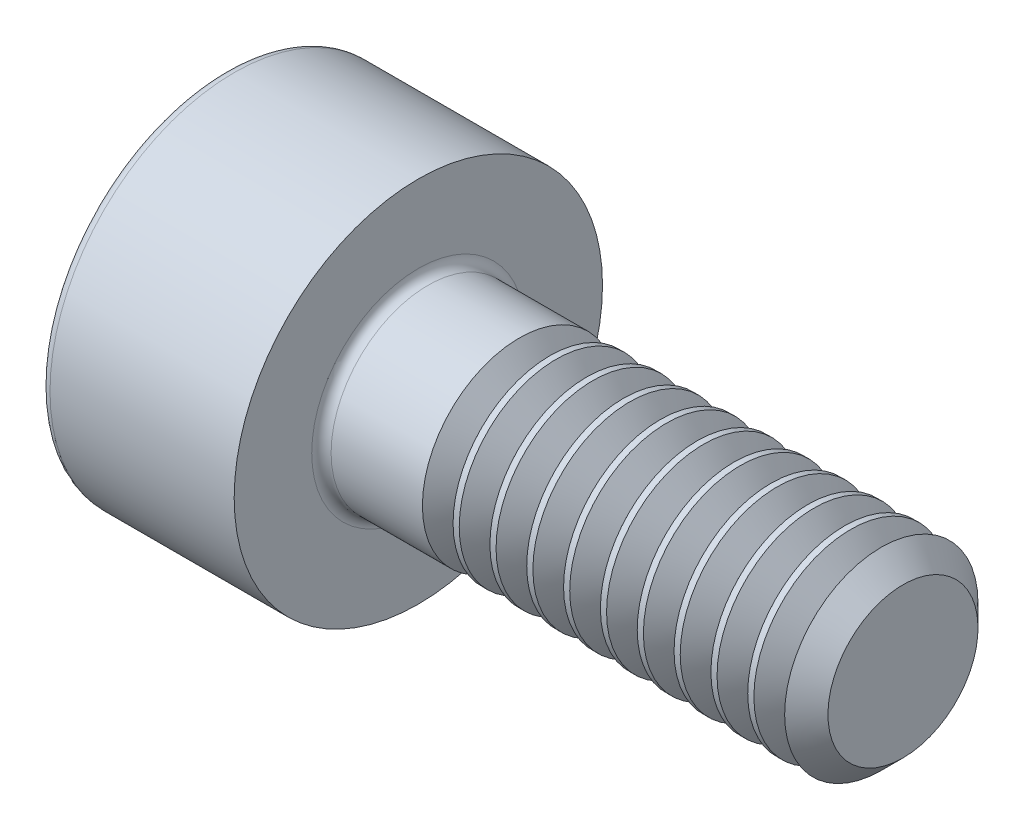
ISO-10303-21;
HEADER;
FILE_DESCRIPTION(('STEP AP214'),'2;1');
FILE_NAME('part.step','',(''),(''),'','','');
FILE_SCHEMA(('AUTOMOTIVE_DESIGN { 1 0 10303 214 1 1 1 1 }'));
ENDSEC;
DATA;
#1=APPLICATION_CONTEXT('core data for automotive mechanical design processes');
#2=APPLICATION_PROTOCOL_DEFINITION('international standard','automotive_design',2000,#1);
#3=PRODUCT_CONTEXT('',#1,'mechanical');
#4=PRODUCT('Part','Part','',(#3));
#5=PRODUCT_RELATED_PRODUCT_CATEGORY('part','',(#4));
#6=PRODUCT_DEFINITION_FORMATION('','',#4);
#7=PRODUCT_DEFINITION_CONTEXT('part definition',#1,'design');
#8=PRODUCT_DEFINITION('design','',#6,#7);
#9=PRODUCT_DEFINITION_SHAPE('','',#8);
#10=(LENGTH_UNIT() NAMED_UNIT(*) SI_UNIT(.MILLI.,.METRE.));
#11=(NAMED_UNIT(*) PLANE_ANGLE_UNIT() SI_UNIT($,.RADIAN.));
#12=(NAMED_UNIT(*) SI_UNIT($,.STERADIAN.) SOLID_ANGLE_UNIT());
#13=UNCERTAINTY_MEASURE_WITH_UNIT(LENGTH_MEASURE(1.E-05),#10,'distance_accuracy_value','');
#14=(GEOMETRIC_REPRESENTATION_CONTEXT(3) GLOBAL_UNCERTAINTY_ASSIGNED_CONTEXT((#13)) GLOBAL_UNIT_ASSIGNED_CONTEXT((#10,
#11,#12)) REPRESENTATION_CONTEXT('',''));
#15=CARTESIAN_POINT('',(0.,0.,0.));
#16=DIRECTION('',(0.,0.,1.));
#17=DIRECTION('',(1.,0.,0.));
#18=AXIS2_PLACEMENT_3D('',#15,#16,#17);
#19=CARTESIAN_POINT('',(7.,0.774,0.));
#20=DIRECTION('',(1.,0.,0.));
#21=DIRECTION('',(0.,0.,-1.));
#22=AXIS2_PLACEMENT_3D('',#19,#20,#21);
#23=PLANE('',#22);
#24=CARTESIAN_POINT('',(6.99999999994816,0.,0.));
#25=DIRECTION('',(-1.,0.,0.));
#26=DIRECTION('',(0.,-1.,0.));
#27=AXIS2_PLACEMENT_3D('',#24,#25,#26);
#28=CIRCLE('',#27,0.774000000035358);
#29=CARTESIAN_POINT('',(6.99999999994816,-0.774000000035357,0.));
#30=VERTEX_POINT('',#29);
#31=EDGE_CURVE('E303',#30,#30,#28,.T.);
#32=ORIENTED_EDGE('',*,*,#31,.F.);
#33=EDGE_LOOP('',(#32));
#34=FACE_BOUND('',#33,.T.);
#35=ADVANCED_FACE('F17',(#34),#23,.T.);
#36=CARTESIAN_POINT('',(6.77649787365908,0.,0.));
#37=DIRECTION('',(-1.,0.,0.));
#38=DIRECTION('',(0.,-1.,0.));
#39=AXIS2_PLACEMENT_3D('',#36,#37,#38);
#40=CONICAL_SURFACE('',#39,0.997502126324434,0.785398163397448);
#41=ORIENTED_EDGE('',*,*,#31,.T.);
#42=EDGE_LOOP('',(#41));
#43=FACE_BOUND('',#42,.T.);
#44=CARTESIAN_POINT('',(6.77649787371593,0.,0.));
#45=DIRECTION('',(1.,0.,0.));
#46=DIRECTION('',(0.,1.,0.));
#47=AXIS2_PLACEMENT_3D('',#44,#45,#46);
#48=CIRCLE('',#47,0.997502126324433);
#49=CARTESIAN_POINT('',(6.77649787371593,0.997502126324434,0.));
#50=VERTEX_POINT('',#49);
#51=EDGE_CURVE('E299',#50,#50,#48,.F.);
#52=ORIENTED_EDGE('',*,*,#51,.F.);
#53=EDGE_LOOP('',(#52));
#54=FACE_BOUND('',#53,.T.);
#55=ADVANCED_FACE('F871',(#43,#54),#40,.T.);
#56=CARTESIAN_POINT('',(6.77649787360224,0.,0.));
#57=DIRECTION('',(1.,0.,0.));
#58=DIRECTION('',(0.,0.,-1.));
#59=AXIS2_PLACEMENT_3D('',#56,#57,#58);
#60=CONICAL_SURFACE('',#59,0.997502126153903,0.959931088753312);
#61=CARTESIAN_POINT('',(6.61999999999807,0.,0.));
#62=DIRECTION('',(-1.,0.,0.));
#63=DIRECTION('',(0.,-1.,0.));
#64=AXIS2_PLACEMENT_3D('',#61,#62,#63);
#65=CIRCLE('',#64,0.773999999978515);
#66=CARTESIAN_POINT('',(6.61999999999807,-0.773999999978514,0.));
#67=VERTEX_POINT('',#66);
#68=EDGE_CURVE('E302',#67,#67,#65,.T.);
#69=ORIENTED_EDGE('',*,*,#68,.F.);
#70=EDGE_LOOP('',(#69));
#71=FACE_BOUND('',#70,.T.);
#72=ORIENTED_EDGE('',*,*,#51,.T.);
#73=EDGE_LOOP('',(#72));
#74=FACE_BOUND('',#73,.T.);
#75=ADVANCED_FACE('F862',(#71,#74),#60,.T.);
#76=CARTESIAN_POINT('',(6.461753096346,0.,0.));
#77=DIRECTION('',(-1.,0.,0.));
#78=DIRECTION('',(0.,0.,1.));
#79=AXIS2_PLACEMENT_3D('',#76,#77,#78);
#80=CONICAL_SURFACE('',#79,1.0000000000332,0.959931088728631);
#81=ORIENTED_EDGE('',*,*,#68,.T.);
#82=EDGE_LOOP('',(#81));
#83=FACE_BOUND('',#82,.T.);
#84=CARTESIAN_POINT('',(6.4617530963646,0.,0.));
#85=DIRECTION('',(-1.,0.,0.));
#86=DIRECTION('',(0.,0.,1.));
#87=AXIS2_PLACEMENT_3D('',#84,#85,#86);
#88=CIRCLE('',#87,1.);
#89=CARTESIAN_POINT('',(6.4617530963646,0.,1.));
#90=VERTEX_POINT('',#89);
#91=EDGE_CURVE('E298',#90,#90,#88,.T.);
#92=ORIENTED_EDGE('',*,*,#91,.F.);
#93=EDGE_LOOP('',(#92));
#94=FACE_BOUND('',#93,.T.);
#95=ADVANCED_FACE('F853',(#83,#94),#80,.T.);
#96=CARTESIAN_POINT('',(-31.75,0.,0.));
#97=DIRECTION('',(-1.,0.,0.));
#98=DIRECTION('',(0.,0.,1.));
#99=AXIS2_PLACEMENT_3D('',#96,#97,#98);
#100=CYLINDRICAL_SURFACE('',#99,1.);
#101=ORIENTED_EDGE('',*,*,#91,.T.);
#102=EDGE_LOOP('',(#101));
#103=FACE_BOUND('',#102,.T.);
#104=CARTESIAN_POINT('',(6.39824690364321,0.,0.));
#105=DIRECTION('',(1.,0.,0.));
#106=DIRECTION('',(0.,1.,0.));
#107=AXIS2_PLACEMENT_3D('',#104,#105,#106);
#108=CIRCLE('',#107,0.999999999919509);
#109=CARTESIAN_POINT('',(6.39824690364321,0.99999999991951,0.));
#110=VERTEX_POINT('',#109);
#111=EDGE_CURVE('E295',#110,#110,#108,.F.);
#112=ORIENTED_EDGE('',*,*,#111,.F.);
#113=EDGE_LOOP('',(#112));
#114=FACE_BOUND('',#113,.T.);
#115=ADVANCED_FACE('F844',(#103,#114),#100,.T.);
#116=CARTESIAN_POINT('',(6.39824690352953,0.,0.));
#117=DIRECTION('',(1.,0.,0.));
#118=DIRECTION('',(0.,0.,-1.));
#119=AXIS2_PLACEMENT_3D('',#116,#117,#118);
#120=CONICAL_SURFACE('',#119,0.999999999748979,0.959931088711648);
#121=ORIENTED_EDGE('',*,*,#111,.T.);
#122=EDGE_LOOP('',(#121));
#123=FACE_BOUND('',#122,.T.);
#124=CARTESIAN_POINT('',(6.23999999999114,0.,0.));
#125=DIRECTION('',(-1.,0.,0.));
#126=DIRECTION('',(0.,-1.,0.));
#127=AXIS2_PLACEMENT_3D('',#124,#125,#126);
#128=CIRCLE('',#127,0.773999999978515);
#129=CARTESIAN_POINT('',(6.23999999999114,-0.773999999978514,0.));
#130=VERTEX_POINT('',#129);
#131=EDGE_CURVE('E292',#130,#130,#128,.T.);
#132=ORIENTED_EDGE('',*,*,#131,.F.);
#133=EDGE_LOOP('',(#132));
#134=FACE_BOUND('',#133,.T.);
#135=ADVANCED_FACE('F835',(#123,#134),#120,.T.);
#136=CARTESIAN_POINT('',(6.08175309633907,0.,0.));
#137=DIRECTION('',(-1.,0.,0.));
#138=DIRECTION('',(0.,0.,1.));
#139=AXIS2_PLACEMENT_3D('',#136,#137,#138);
#140=CONICAL_SURFACE('',#139,1.0000000000332,0.959931088728631);
#141=CARTESIAN_POINT('',(6.08175309636461,0.,0.));
#142=DIRECTION('',(-1.,0.,0.));
#143=DIRECTION('',(0.,0.,1.));
#144=AXIS2_PLACEMENT_3D('',#141,#142,#143);
#145=CIRCLE('',#144,1.);
#146=CARTESIAN_POINT('',(6.08175309636461,0.,1.));
#147=VERTEX_POINT('',#146);
#148=EDGE_CURVE('E289',#147,#147,#145,.T.);
#149=ORIENTED_EDGE('',*,*,#148,.F.);
#150=EDGE_LOOP('',(#149));
#151=FACE_BOUND('',#150,.T.);
#152=ORIENTED_EDGE('',*,*,#131,.T.);
#153=EDGE_LOOP('',(#152));
#154=FACE_BOUND('',#153,.T.);
#155=ADVANCED_FACE('F826',(#151,#154),#140,.T.);
#156=CARTESIAN_POINT('',(-31.75,0.,0.));
#157=DIRECTION('',(-1.,0.,0.));
#158=DIRECTION('',(0.,0.,1.));
#159=AXIS2_PLACEMENT_3D('',#156,#157,#158);
#160=CYLINDRICAL_SURFACE('',#159,1.);
#161=CARTESIAN_POINT('',(6.01824690363628,0.,0.));
#162=DIRECTION('',(1.,0.,0.));
#163=DIRECTION('',(0.,1.,0.));
#164=AXIS2_PLACEMENT_3D('',#161,#162,#163);
#165=CIRCLE('',#164,0.999999999919509);
#166=CARTESIAN_POINT('',(6.01824690363628,0.99999999991951,0.));
#167=VERTEX_POINT('',#166);
#168=EDGE_CURVE('E286',#167,#167,#165,.F.);
#169=ORIENTED_EDGE('',*,*,#168,.F.);
#170=EDGE_LOOP('',(#169));
#171=FACE_BOUND('',#170,.T.);
#172=ORIENTED_EDGE('',*,*,#148,.T.);
#173=EDGE_LOOP('',(#172));
#174=FACE_BOUND('',#173,.T.);
#175=ADVANCED_FACE('F817',(#171,#174),#160,.T.);
#176=CARTESIAN_POINT('',(6.01824690352259,0.,0.));
#177=DIRECTION('',(1.,0.,0.));
#178=DIRECTION('',(0.,0.,-1.));
#179=AXIS2_PLACEMENT_3D('',#176,#177,#178);
#180=CONICAL_SURFACE('',#179,0.999999999748979,0.959931088711648);
#181=CARTESIAN_POINT('',(5.85999999998421,0.,0.));
#182=DIRECTION('',(-1.,0.,0.));
#183=DIRECTION('',(0.,-1.,0.));
#184=AXIS2_PLACEMENT_3D('',#181,#182,#183);
#185=CIRCLE('',#184,0.773999999978515);
#186=CARTESIAN_POINT('',(5.85999999998421,-0.773999999978514,0.));
#187=VERTEX_POINT('',#186);
#188=EDGE_CURVE('E283',#187,#187,#185,.T.);
#189=ORIENTED_EDGE('',*,*,#188,.F.);
#190=EDGE_LOOP('',(#189));
#191=FACE_BOUND('',#190,.T.);
#192=ORIENTED_EDGE('',*,*,#168,.T.);
#193=EDGE_LOOP('',(#192));
#194=FACE_BOUND('',#193,.T.);
#195=ADVANCED_FACE('F808',(#191,#194),#180,.T.);
#196=CARTESIAN_POINT('',(5.70175309633214,0.,0.));
#197=DIRECTION('',(-1.,0.,0.));
#198=DIRECTION('',(0.,0.,1.));
#199=AXIS2_PLACEMENT_3D('',#196,#197,#198);
#200=CONICAL_SURFACE('',#199,1.0000000000332,0.959931088728631);
#201=ORIENTED_EDGE('',*,*,#188,.T.);
#202=EDGE_LOOP('',(#201));
#203=FACE_BOUND('',#202,.T.);
#204=CARTESIAN_POINT('',(5.7017530963646,0.,0.));
#205=DIRECTION('',(-1.,0.,0.));
#206=DIRECTION('',(0.,0.,1.));
#207=AXIS2_PLACEMENT_3D('',#204,#205,#206);
#208=CIRCLE('',#207,1.);
#209=CARTESIAN_POINT('',(5.7017530963646,0.,1.));
#210=VERTEX_POINT('',#209);
#211=EDGE_CURVE('E280',#210,#210,#208,.T.);
#212=ORIENTED_EDGE('',*,*,#211,.F.);
#213=EDGE_LOOP('',(#212));
#214=FACE_BOUND('',#213,.T.);
#215=ADVANCED_FACE('F799',(#203,#214),#200,.T.);
#216=CARTESIAN_POINT('',(-31.75,0.,0.));
#217=DIRECTION('',(-1.,0.,0.));
#218=DIRECTION('',(0.,0.,1.));
#219=AXIS2_PLACEMENT_3D('',#216,#217,#218);
#220=CYLINDRICAL_SURFACE('',#219,1.);
#221=ORIENTED_EDGE('',*,*,#211,.T.);
#222=EDGE_LOOP('',(#221));
#223=FACE_BOUND('',#222,.T.);
#224=CARTESIAN_POINT('',(5.63824690362935,0.,0.));
#225=DIRECTION('',(1.,0.,0.));
#226=DIRECTION('',(0.,1.,0.));
#227=AXIS2_PLACEMENT_3D('',#224,#225,#226);
#228=CIRCLE('',#227,0.999999999919509);
#229=CARTESIAN_POINT('',(5.63824690362935,0.99999999991951,0.));
#230=VERTEX_POINT('',#229);
#231=EDGE_CURVE('E277',#230,#230,#228,.F.);
#232=ORIENTED_EDGE('',*,*,#231,.F.);
#233=EDGE_LOOP('',(#232));
#234=FACE_BOUND('',#233,.T.);
#235=ADVANCED_FACE('F790',(#223,#234),#220,.T.);
#236=CARTESIAN_POINT('',(5.63824690351566,0.,0.));
#237=DIRECTION('',(1.,0.,0.));
#238=DIRECTION('',(0.,0.,-1.));
#239=AXIS2_PLACEMENT_3D('',#236,#237,#238);
#240=CONICAL_SURFACE('',#239,0.999999999748979,0.959931088711648);
#241=ORIENTED_EDGE('',*,*,#231,.T.);
#242=EDGE_LOOP('',(#241));
#243=FACE_BOUND('',#242,.T.);
#244=CARTESIAN_POINT('',(5.47999999997728,0.,0.));
#245=DIRECTION('',(-1.,0.,0.));
#246=DIRECTION('',(0.,-1.,0.));
#247=AXIS2_PLACEMENT_3D('',#244,#245,#246);
#248=CIRCLE('',#247,0.773999999978515);
#249=CARTESIAN_POINT('',(5.47999999997728,-0.773999999978514,0.));
#250=VERTEX_POINT('',#249);
#251=EDGE_CURVE('E274',#250,#250,#248,.T.);
#252=ORIENTED_EDGE('',*,*,#251,.F.);
#253=EDGE_LOOP('',(#252));
#254=FACE_BOUND('',#253,.T.);
#255=ADVANCED_FACE('F781',(#243,#254),#240,.T.);
#256=CARTESIAN_POINT('',(5.32175309632521,0.,0.));
#257=DIRECTION('',(-1.,0.,0.));
#258=DIRECTION('',(0.,0.,1.));
#259=AXIS2_PLACEMENT_3D('',#256,#257,#258);
#260=CONICAL_SURFACE('',#259,1.0000000000332,0.959931088728631);
#261=CARTESIAN_POINT('',(5.3217530963646,0.,0.));
#262=DIRECTION('',(-1.,0.,0.));
#263=DIRECTION('',(0.,0.,1.));
#264=AXIS2_PLACEMENT_3D('',#261,#262,#263);
#265=CIRCLE('',#264,1.);
#266=CARTESIAN_POINT('',(5.3217530963646,0.,1.));
#267=VERTEX_POINT('',#266);
#268=EDGE_CURVE('E271',#267,#267,#265,.T.);
#269=ORIENTED_EDGE('',*,*,#268,.F.);
#270=EDGE_LOOP('',(#269));
#271=FACE_BOUND('',#270,.T.);
#272=ORIENTED_EDGE('',*,*,#251,.T.);
#273=EDGE_LOOP('',(#272));
#274=FACE_BOUND('',#273,.T.);
#275=ADVANCED_FACE('F772',(#271,#274),#260,.T.);
#276=CARTESIAN_POINT('',(-31.75,0.,0.));
#277=DIRECTION('',(-1.,0.,0.));
#278=DIRECTION('',(0.,0.,1.));
#279=AXIS2_PLACEMENT_3D('',#276,#277,#278);
#280=CYLINDRICAL_SURFACE('',#279,1.);
#281=CARTESIAN_POINT('',(5.25824690362242,0.,0.));
#282=DIRECTION('',(1.,0.,0.));
#283=DIRECTION('',(0.,1.,0.));
#284=AXIS2_PLACEMENT_3D('',#281,#282,#283);
#285=CIRCLE('',#284,0.999999999919509);
#286=CARTESIAN_POINT('',(5.25824690362242,0.99999999991951,0.));
#287=VERTEX_POINT('',#286);
#288=EDGE_CURVE('E268',#287,#287,#285,.F.);
#289=ORIENTED_EDGE('',*,*,#288,.F.);
#290=EDGE_LOOP('',(#289));
#291=FACE_BOUND('',#290,.T.);
#292=ORIENTED_EDGE('',*,*,#268,.T.);
#293=EDGE_LOOP('',(#292));
#294=FACE_BOUND('',#293,.T.);
#295=ADVANCED_FACE('F763',(#291,#294),#280,.T.);
#296=CARTESIAN_POINT('',(5.25824690350873,0.,0.));
#297=DIRECTION('',(1.,0.,0.));
#298=DIRECTION('',(0.,0.,-1.));
#299=AXIS2_PLACEMENT_3D('',#296,#297,#298);
#300=CONICAL_SURFACE('',#299,0.999999999748979,0.959931088711648);
#301=CARTESIAN_POINT('',(5.10000000002719,0.,0.));
#302=DIRECTION('',(-1.,0.,0.));
#303=DIRECTION('',(0.,-1.,0.));
#304=AXIS2_PLACEMENT_3D('',#301,#302,#303);
#305=CIRCLE('',#304,0.773999999978515);
#306=CARTESIAN_POINT('',(5.10000000002719,-0.773999999978514,0.));
#307=VERTEX_POINT('',#306);
#308=EDGE_CURVE('E265',#307,#307,#305,.T.);
#309=ORIENTED_EDGE('',*,*,#308,.F.);
#310=EDGE_LOOP('',(#309));
#311=FACE_BOUND('',#310,.T.);
#312=ORIENTED_EDGE('',*,*,#288,.T.);
#313=EDGE_LOOP('',(#312));
#314=FACE_BOUND('',#313,.T.);
#315=ADVANCED_FACE('F754',(#311,#314),#300,.T.);
#316=CARTESIAN_POINT('',(4.94175309637512,0.,0.));
#317=DIRECTION('',(-1.,0.,0.));
#318=DIRECTION('',(0.,0.,1.));
#319=AXIS2_PLACEMENT_3D('',#316,#317,#318);
#320=CONICAL_SURFACE('',#319,1.0000000000332,0.959931088728631);
#321=ORIENTED_EDGE('',*,*,#308,.T.);
#322=EDGE_LOOP('',(#321));
#323=FACE_BOUND('',#322,.T.);
#324=CARTESIAN_POINT('',(4.9417530963646,0.,0.));
#325=DIRECTION('',(-1.,0.,0.));
#326=DIRECTION('',(0.,0.,1.));
#327=AXIS2_PLACEMENT_3D('',#324,#325,#326);
#328=CIRCLE('',#327,1.);
#329=CARTESIAN_POINT('',(4.9417530963646,0.,1.));
#330=VERTEX_POINT('',#329);
#331=EDGE_CURVE('E262',#330,#330,#328,.T.);
#332=ORIENTED_EDGE('',*,*,#331,.F.);
#333=EDGE_LOOP('',(#332));
#334=FACE_BOUND('',#333,.T.);
#335=ADVANCED_FACE('F745',(#323,#334),#320,.T.);
#336=CARTESIAN_POINT('',(-31.75,0.,0.));
#337=DIRECTION('',(-1.,0.,0.));
#338=DIRECTION('',(0.,0.,1.));
#339=AXIS2_PLACEMENT_3D('',#336,#337,#338);
#340=CYLINDRICAL_SURFACE('',#339,1.);
#341=ORIENTED_EDGE('',*,*,#331,.T.);
#342=EDGE_LOOP('',(#341));
#343=FACE_BOUND('',#342,.T.);
#344=CARTESIAN_POINT('',(4.87824690361549,0.,0.));
#345=DIRECTION('',(1.,0.,0.));
#346=DIRECTION('',(0.,1.,0.));
#347=AXIS2_PLACEMENT_3D('',#344,#345,#346);
#348=CIRCLE('',#347,0.999999999919509);
#349=CARTESIAN_POINT('',(4.87824690361549,0.99999999991951,0.));
#350=VERTEX_POINT('',#349);
#351=EDGE_CURVE('E259',#350,#350,#348,.F.);
#352=ORIENTED_EDGE('',*,*,#351,.F.);
#353=EDGE_LOOP('',(#352));
#354=FACE_BOUND('',#353,.T.);
#355=ADVANCED_FACE('F736',(#343,#354),#340,.T.);
#356=CARTESIAN_POINT('',(4.8782469035018,0.,0.));
#357=DIRECTION('',(1.,0.,0.));
#358=DIRECTION('',(0.,0.,-1.));
#359=AXIS2_PLACEMENT_3D('',#356,#357,#358);
#360=CONICAL_SURFACE('',#359,0.999999999748979,0.959931088711648);
#361=ORIENTED_EDGE('',*,*,#351,.T.);
#362=EDGE_LOOP('',(#361));
#363=FACE_BOUND('',#362,.T.);
#364=CARTESIAN_POINT('',(4.72000000002026,0.,0.));
#365=DIRECTION('',(-1.,0.,0.));
#366=DIRECTION('',(0.,-1.,0.));
#367=AXIS2_PLACEMENT_3D('',#364,#365,#366);
#368=CIRCLE('',#367,0.773999999978515);
#369=CARTESIAN_POINT('',(4.72000000002026,-0.773999999978514,0.));
#370=VERTEX_POINT('',#369);
#371=EDGE_CURVE('E256',#370,#370,#368,.T.);
#372=ORIENTED_EDGE('',*,*,#371,.F.);
#373=EDGE_LOOP('',(#372));
#374=FACE_BOUND('',#373,.T.);
#375=ADVANCED_FACE('F727',(#363,#374),#360,.T.);
#376=CARTESIAN_POINT('',(4.56175309636819,0.,0.));
#377=DIRECTION('',(-1.,0.,0.));
#378=DIRECTION('',(0.,0.,1.));
#379=AXIS2_PLACEMENT_3D('',#376,#377,#378);
#380=CONICAL_SURFACE('',#379,1.0000000000332,0.959931088728631);
#381=CARTESIAN_POINT('',(4.56175309636461,0.,0.));
#382=DIRECTION('',(-1.,0.,0.));
#383=DIRECTION('',(0.,0.,1.));
#384=AXIS2_PLACEMENT_3D('',#381,#382,#383);
#385=CIRCLE('',#384,1.);
#386=CARTESIAN_POINT('',(4.56175309636461,0.,1.));
#387=VERTEX_POINT('',#386);
#388=EDGE_CURVE('E253',#387,#387,#385,.T.);
#389=ORIENTED_EDGE('',*,*,#388,.F.);
#390=EDGE_LOOP('',(#389));
#391=FACE_BOUND('',#390,.T.);
#392=ORIENTED_EDGE('',*,*,#371,.T.);
#393=EDGE_LOOP('',(#392));
#394=FACE_BOUND('',#393,.T.);
#395=ADVANCED_FACE('F718',(#391,#394),#380,.T.);
#396=CARTESIAN_POINT('',(-31.75,0.,0.));
#397=DIRECTION('',(-1.,0.,0.));
#398=DIRECTION('',(0.,0.,1.));
#399=AXIS2_PLACEMENT_3D('',#396,#397,#398);
#400=CYLINDRICAL_SURFACE('',#399,1.);
#401=CARTESIAN_POINT('',(4.49824690360856,0.,0.));
#402=DIRECTION('',(1.,0.,0.));
#403=DIRECTION('',(0.,1.,0.));
#404=AXIS2_PLACEMENT_3D('',#401,#402,#403);
#405=CIRCLE('',#404,0.999999999919509);
#406=CARTESIAN_POINT('',(4.49824690360856,0.99999999991951,0.));
#407=VERTEX_POINT('',#406);
#408=EDGE_CURVE('E250',#407,#407,#405,.F.);
#409=ORIENTED_EDGE('',*,*,#408,.F.);
#410=EDGE_LOOP('',(#409));
#411=FACE_BOUND('',#410,.T.);
#412=ORIENTED_EDGE('',*,*,#388,.T.);
#413=EDGE_LOOP('',(#412));
#414=FACE_BOUND('',#413,.T.);
#415=ADVANCED_FACE('F709',(#411,#414),#400,.T.);
#416=CARTESIAN_POINT('',(4.49824690349487,0.,0.));
#417=DIRECTION('',(1.,0.,0.));
#418=DIRECTION('',(0.,0.,-1.));
#419=AXIS2_PLACEMENT_3D('',#416,#417,#418);
#420=CONICAL_SURFACE('',#419,0.999999999748979,0.959931088711648);
#421=CARTESIAN_POINT('',(4.34000000001333,0.,0.));
#422=DIRECTION('',(-1.,0.,0.));
#423=DIRECTION('',(0.,-1.,0.));
#424=AXIS2_PLACEMENT_3D('',#421,#422,#423);
#425=CIRCLE('',#424,0.773999999978515);
#426=CARTESIAN_POINT('',(4.34000000001333,-0.773999999978514,0.));
#427=VERTEX_POINT('',#426);
#428=EDGE_CURVE('E247',#427,#427,#425,.T.);
#429=ORIENTED_EDGE('',*,*,#428,.F.);
#430=EDGE_LOOP('',(#429));
#431=FACE_BOUND('',#430,.T.);
#432=ORIENTED_EDGE('',*,*,#408,.T.);
#433=EDGE_LOOP('',(#432));
#434=FACE_BOUND('',#433,.T.);
#435=ADVANCED_FACE('F700',(#431,#434),#420,.T.);
#436=CARTESIAN_POINT('',(4.18175309636126,0.,0.));
#437=DIRECTION('',(-1.,0.,0.));
#438=DIRECTION('',(0.,0.,1.));
#439=AXIS2_PLACEMENT_3D('',#436,#437,#438);
#440=CONICAL_SURFACE('',#439,1.0000000000332,0.959931088728631);
#441=ORIENTED_EDGE('',*,*,#428,.T.);
#442=EDGE_LOOP('',(#441));
#443=FACE_BOUND('',#442,.T.);
#444=CARTESIAN_POINT('',(4.18175309636461,0.,0.));
#445=DIRECTION('',(-1.,0.,0.));
#446=DIRECTION('',(0.,0.,1.));
#447=AXIS2_PLACEMENT_3D('',#444,#445,#446);
#448=CIRCLE('',#447,1.);
#449=CARTESIAN_POINT('',(4.18175309636461,0.,1.));
#450=VERTEX_POINT('',#449);
#451=EDGE_CURVE('E244',#450,#450,#448,.T.);
#452=ORIENTED_EDGE('',*,*,#451,.F.);
#453=EDGE_LOOP('',(#452));
#454=FACE_BOUND('',#453,.T.);
#455=ADVANCED_FACE('F691',(#443,#454),#440,.T.);
#456=CARTESIAN_POINT('',(-31.75,0.,0.));
#457=DIRECTION('',(-1.,0.,0.));
#458=DIRECTION('',(0.,0.,1.));
#459=AXIS2_PLACEMENT_3D('',#456,#457,#458);
#460=CYLINDRICAL_SURFACE('',#459,1.);
#461=ORIENTED_EDGE('',*,*,#451,.T.);
#462=EDGE_LOOP('',(#461));
#463=FACE_BOUND('',#462,.T.);
#464=CARTESIAN_POINT('',(4.11824690365847,0.,0.));
#465=DIRECTION('',(1.,0.,0.));
#466=DIRECTION('',(0.,1.,0.));
#467=AXIS2_PLACEMENT_3D('',#464,#465,#466);
#468=CIRCLE('',#467,0.999999999919509);
#469=CARTESIAN_POINT('',(4.11824690365847,0.99999999991951,0.));
#470=VERTEX_POINT('',#469);
#471=EDGE_CURVE('E241',#470,#470,#468,.F.);
#472=ORIENTED_EDGE('',*,*,#471,.F.);
#473=EDGE_LOOP('',(#472));
#474=FACE_BOUND('',#473,.T.);
#475=ADVANCED_FACE('F682',(#463,#474),#460,.T.);
#476=CARTESIAN_POINT('',(4.11824690354479,0.,0.));
#477=DIRECTION('',(1.,0.,0.));
#478=DIRECTION('',(0.,0.,-1.));
#479=AXIS2_PLACEMENT_3D('',#476,#477,#478);
#480=CONICAL_SURFACE('',#479,0.999999999748979,0.959931088711648);
#481=ORIENTED_EDGE('',*,*,#471,.T.);
#482=EDGE_LOOP('',(#481));
#483=FACE_BOUND('',#482,.T.);
#484=CARTESIAN_POINT('',(3.9600000000064,0.,0.));
#485=DIRECTION('',(-1.,0.,0.));
#486=DIRECTION('',(0.,-1.,0.));
#487=AXIS2_PLACEMENT_3D('',#484,#485,#486);
#488=CIRCLE('',#487,0.773999999978515);
#489=CARTESIAN_POINT('',(3.9600000000064,-0.773999999978514,0.));
#490=VERTEX_POINT('',#489);
#491=EDGE_CURVE('E238',#490,#490,#488,.T.);
#492=ORIENTED_EDGE('',*,*,#491,.F.);
#493=EDGE_LOOP('',(#492));
#494=FACE_BOUND('',#493,.T.);
#495=ADVANCED_FACE('F673',(#483,#494),#480,.T.);
#496=CARTESIAN_POINT('',(3.80175309635433,0.,0.));
#497=DIRECTION('',(-1.,0.,0.));
#498=DIRECTION('',(0.,-1.,0.));
#499=AXIS2_PLACEMENT_3D('',#496,#497,#498);
#500=CONICAL_SURFACE('',#499,1.0000000000332,0.959931088728629);
#501=CARTESIAN_POINT('',(3.8017530963646,0.,0.));
#502=DIRECTION('',(-1.,0.,0.));
#503=DIRECTION('',(0.,0.,1.));
#504=AXIS2_PLACEMENT_3D('',#501,#502,#503);
#505=CIRCLE('',#504,1.);
#506=CARTESIAN_POINT('',(3.8017530963646,0.,1.));
#507=VERTEX_POINT('',#506);
#508=EDGE_CURVE('E233',#507,#507,#505,.T.);
#509=ORIENTED_EDGE('',*,*,#508,.F.);
#510=EDGE_LOOP('',(#509));
#511=FACE_BOUND('',#510,.T.);
#512=ORIENTED_EDGE('',*,*,#491,.T.);
#513=EDGE_LOOP('',(#512));
#514=FACE_BOUND('',#513,.T.);
#515=ADVANCED_FACE('F664',(#511,#514),#500,.T.);
#516=CARTESIAN_POINT('',(-31.75,0.,0.));
#517=DIRECTION('',(-1.,0.,0.));
#518=DIRECTION('',(0.,0.,1.));
#519=AXIS2_PLACEMENT_3D('',#516,#517,#518);
#520=CYLINDRICAL_SURFACE('',#519,1.);
#521=CARTESIAN_POINT('',(3.73824690365154,0.,0.));
#522=DIRECTION('',(1.,0.,0.));
#523=DIRECTION('',(0.,1.,0.));
#524=AXIS2_PLACEMENT_3D('',#521,#522,#523);
#525=CIRCLE('',#524,0.999999999919509);
#526=CARTESIAN_POINT('',(3.73824690365154,0.99999999991951,0.));
#527=VERTEX_POINT('',#526);
#528=EDGE_CURVE('E230',#527,#527,#525,.F.);
#529=ORIENTED_EDGE('',*,*,#528,.F.);
#530=EDGE_LOOP('',(#529));
#531=FACE_BOUND('',#530,.T.);
#532=ORIENTED_EDGE('',*,*,#508,.T.);
#533=EDGE_LOOP('',(#532));
#534=FACE_BOUND('',#533,.T.);
#535=ADVANCED_FACE('F655',(#531,#534),#520,.T.);
#536=CARTESIAN_POINT('',(3.73824690353786,0.,0.));
#537=DIRECTION('',(1.,0.,0.));
#538=DIRECTION('',(0.,0.,-1.));
#539=AXIS2_PLACEMENT_3D('',#536,#537,#538);
#540=CONICAL_SURFACE('',#539,0.999999999748979,0.959931088711648);
#541=CARTESIAN_POINT('',(3.57999999994263,0.,0.));
#542=DIRECTION('',(-1.,0.,0.));
#543=DIRECTION('',(0.,-1.,0.));
#544=AXIS2_PLACEMENT_3D('',#541,#542,#543);
#545=CIRCLE('',#544,0.774000000035358);
#546=CARTESIAN_POINT('',(3.57999999994263,-0.774000000035357,0.));
#547=VERTEX_POINT('',#546);
#548=EDGE_CURVE('E227',#547,#547,#545,.T.);
#549=ORIENTED_EDGE('',*,*,#548,.F.);
#550=EDGE_LOOP('',(#549));
#551=FACE_BOUND('',#550,.T.);
#552=ORIENTED_EDGE('',*,*,#528,.T.);
#553=EDGE_LOOP('',(#552));
#554=FACE_BOUND('',#553,.T.);
#555=ADVANCED_FACE('F646',(#551,#554),#540,.T.);
#556=CARTESIAN_POINT('',(3.4217530963474,0.,0.));
#557=DIRECTION('',(-1.,0.,0.));
#558=DIRECTION('',(0.,-1.,0.));
#559=AXIS2_PLACEMENT_3D('',#556,#557,#558);
#560=CONICAL_SURFACE('',#559,0.999999999976354,0.959931088644069);
#561=ORIENTED_EDGE('',*,*,#548,.T.);
#562=EDGE_LOOP('',(#561));
#563=FACE_BOUND('',#562,.T.);
#564=CARTESIAN_POINT('',(3.4217530963646,0.,0.));
#565=DIRECTION('',(-1.,0.,0.));
#566=DIRECTION('',(0.,0.,1.));
#567=AXIS2_PLACEMENT_3D('',#564,#565,#566);
#568=CIRCLE('',#567,1.);
#569=CARTESIAN_POINT('',(3.4217530963646,0.,1.));
#570=VERTEX_POINT('',#569);
#571=EDGE_CURVE('E224',#570,#570,#568,.T.);
#572=ORIENTED_EDGE('',*,*,#571,.F.);
#573=EDGE_LOOP('',(#572));
#574=FACE_BOUND('',#573,.T.);
#575=ADVANCED_FACE('F637',(#563,#574),#560,.T.);
#576=CARTESIAN_POINT('',(-31.75,0.,0.));
#577=DIRECTION('',(-1.,0.,0.));
#578=DIRECTION('',(0.,0.,1.));
#579=AXIS2_PLACEMENT_3D('',#576,#577,#578);
#580=CYLINDRICAL_SURFACE('',#579,1.);
#581=ORIENTED_EDGE('',*,*,#571,.T.);
#582=EDGE_LOOP('',(#581));
#583=FACE_BOUND('',#582,.T.);
#584=CARTESIAN_POINT('',(3.35824690364461,0.,0.));
#585=DIRECTION('',(1.,0.,0.));
#586=DIRECTION('',(0.,1.,0.));
#587=AXIS2_PLACEMENT_3D('',#584,#585,#586);
#588=CIRCLE('',#587,0.999999999919509);
#589=CARTESIAN_POINT('',(3.35824690364461,0.99999999991951,0.));
#590=VERTEX_POINT('',#589);
#591=EDGE_CURVE('E221',#590,#590,#588,.F.);
#592=ORIENTED_EDGE('',*,*,#591,.F.);
#593=EDGE_LOOP('',(#592));
#594=FACE_BOUND('',#593,.T.);
#595=ADVANCED_FACE('F628',(#583,#594),#580,.T.);
#596=CARTESIAN_POINT('',(3.35824690353093,0.,0.));
#597=DIRECTION('',(1.,0.,0.));
#598=DIRECTION('',(0.,1.,0.));
#599=AXIS2_PLACEMENT_3D('',#596,#597,#598);
#600=CONICAL_SURFACE('',#599,0.999999999748979,0.959931088711648);
#601=ORIENTED_EDGE('',*,*,#591,.T.);
#602=EDGE_LOOP('',(#601));
#603=FACE_BOUND('',#602,.T.);
#604=CARTESIAN_POINT('',(3.19999999999254,0.,0.));
#605=DIRECTION('',(-1.,0.,0.));
#606=DIRECTION('',(0.,-1.,0.));
#607=AXIS2_PLACEMENT_3D('',#604,#605,#606);
#608=CIRCLE('',#607,0.773999999978515);
#609=CARTESIAN_POINT('',(3.19999999999254,-0.773999999978514,0.));
#610=VERTEX_POINT('',#609);
#611=EDGE_CURVE('E108',#610,#610,#608,.T.);
#612=ORIENTED_EDGE('',*,*,#611,.F.);
#613=EDGE_LOOP('',(#612));
#614=FACE_BOUND('',#613,.T.);
#615=ADVANCED_FACE('F619',(#603,#614),#600,.T.);
#616=CARTESIAN_POINT('',(1.0000000000332,0.,0.));
#617=DIRECTION('',(-1.,0.,0.));
#618=DIRECTION('',(0.,0.,1.));
#619=AXIS2_PLACEMENT_3D('',#616,#617,#618);
#620=CONICAL_SURFACE('',#619,0.772499999868614,1.04719755118058);
#621=CARTESIAN_POINT('',(1.44600308294685,0.,1.13686837721616E-10));
#622=VERTEX_POINT('',#621);
#623=VERTEX_LOOP('',#622);
#624=FACE_BOUND('',#623,.T.);
#625=CARTESIAN_POINT('',(0.999999999967559,0.,0.));
#626=DIRECTION('',(-1.,0.,0.));
#627=DIRECTION('',(0.,0.,1.));
#628=AXIS2_PLACEMENT_3D('',#625,#626,#627);
#629=CIRCLE('',#628,0.772499999982301);
#630=CARTESIAN_POINT('',(0.99999999998378,-0.669004624415815,0.386249999995576));
#631=VERTEX_POINT('',#630);
#632=CARTESIAN_POINT('',(0.999999999992079,0.,0.772499999967152));
#633=VERTEX_POINT('',#632);
#634=EDGE_CURVE('E97',#631,#633,#629,.T.);
#635=ORIENTED_EDGE('',*,*,#634,.T.);
#636=CARTESIAN_POINT('',(0.999999999967559,0.,0.));
#637=DIRECTION('',(-1.,0.,0.));
#638=DIRECTION('',(0.,0.,1.));
#639=AXIS2_PLACEMENT_3D('',#636,#637,#638);
#640=CIRCLE('',#639,0.772499999982301);
#641=CARTESIAN_POINT('',(0.99999999998378,0.669004624415814,0.386249999995574));
#642=VERTEX_POINT('',#641);
#643=EDGE_CURVE('E100',#633,#642,#640,.T.);
#644=ORIENTED_EDGE('',*,*,#643,.T.);
#645=CARTESIAN_POINT('',(0.999999999967559,0.,0.));
#646=DIRECTION('',(-1.,0.,0.));
#647=DIRECTION('',(0.,0.,1.));
#648=AXIS2_PLACEMENT_3D('',#645,#646,#647);
#649=CIRCLE('',#648,0.772499999982301);
#650=CARTESIAN_POINT('',(0.99999999998378,0.669004624415814,-0.386249999995576));
#651=VERTEX_POINT('',#650);
#652=EDGE_CURVE('E103',#642,#651,#649,.T.);
#653=ORIENTED_EDGE('',*,*,#652,.T.);
#654=CARTESIAN_POINT('',(0.999999999967559,0.,0.));
#655=DIRECTION('',(-1.,0.,0.));
#656=DIRECTION('',(0.,0.,1.));
#657=AXIS2_PLACEMENT_3D('',#654,#655,#656);
#658=CIRCLE('',#657,0.772499999982301);
#659=CARTESIAN_POINT('',(0.999999999992079,0.,-0.772499999967156));
#660=VERTEX_POINT('',#659);
#661=EDGE_CURVE('E118',#651,#660,#658,.T.);
#662=ORIENTED_EDGE('',*,*,#661,.T.);
#663=CARTESIAN_POINT('',(0.999999999967559,0.,0.));
#664=DIRECTION('',(-1.,0.,0.));
#665=DIRECTION('',(0.,0.,1.));
#666=AXIS2_PLACEMENT_3D('',#663,#664,#665);
#667=CIRCLE('',#666,0.772499999982301);
#668=CARTESIAN_POINT('',(0.99999999998378,-0.669004624415817,-0.386249999995576));
#669=VERTEX_POINT('',#668);
#670=EDGE_CURVE('E119',#660,#669,#667,.T.);
#671=ORIENTED_EDGE('',*,*,#670,.T.);
#672=CARTESIAN_POINT('',(0.999999999967559,0.,0.));
#673=DIRECTION('',(-1.,0.,0.));
#674=DIRECTION('',(0.,0.,1.));
#675=AXIS2_PLACEMENT_3D('',#672,#673,#674);
#676=CIRCLE('',#675,0.772499999982301);
#677=EDGE_CURVE('E313',#669,#631,#676,.T.);
#678=ORIENTED_EDGE('',*,*,#677,.T.);
#679=EDGE_LOOP('',(#635,#644,#653,#662,#671,#678));
#680=FACE_BOUND('',#679,.T.);
#681=ADVANCED_FACE('F102',(#624,#680),#620,.F.);
#682=CARTESIAN_POINT('',(3.04175309634047,0.,0.));
#683=DIRECTION('',(-1.,0.,0.));
#684=DIRECTION('',(0.,0.,1.));
#685=AXIS2_PLACEMENT_3D('',#682,#683,#684);
#686=CONICAL_SURFACE('',#685,1.0000000000332,0.959931088728631);
#687=CARTESIAN_POINT('',(3.04175309636461,0.,0.));
#688=DIRECTION('',(-1.,0.,0.));
#689=DIRECTION('',(0.,0.,1.));
#690=AXIS2_PLACEMENT_3D('',#687,#688,#689);
#691=CIRCLE('',#690,1.);
#692=CARTESIAN_POINT('',(3.04175309636461,0.,1.));
#693=VERTEX_POINT('',#692);
#694=EDGE_CURVE('E133',#693,#693,#691,.T.);
#695=ORIENTED_EDGE('',*,*,#694,.F.);
#696=EDGE_LOOP('',(#695));
#697=FACE_BOUND('',#696,.T.);
#698=ORIENTED_EDGE('',*,*,#611,.T.);
#699=EDGE_LOOP('',(#698));
#700=FACE_BOUND('',#699,.T.);
#701=ADVANCED_FACE('F603',(#697,#700),#686,.T.);
#702=CARTESIAN_POINT('',(1.,0.,1.545));
#703=DIRECTION('',(1.,0.,0.));
#704=DIRECTION('',(0.,0.,-1.));
#705=AXIS2_PLACEMENT_3D('',#702,#703,#704);
#706=PLANE('',#705);
#707=DIRECTION('',(0.,0.499999999999999,-0.866025403784439));
#708=VECTOR('',#707,1.);
#709=CARTESIAN_POINT('',(1.,0.892006165897969,0.));
#710=LINE('',#709,#708);
#711=CARTESIAN_POINT('',(1.,0.446003082948984,0.772499999999997));
#712=VERTEX_POINT('',#711);
#713=EDGE_CURVE('E122',#642,#712,#710,.F.);
#714=ORIENTED_EDGE('',*,*,#713,.F.);
#715=ORIENTED_EDGE('',*,*,#643,.F.);
#716=DIRECTION('',(0.,-1.,0.));
#717=VECTOR('',#716,1.);
#718=CARTESIAN_POINT('',(1.,-0.446003082948989,0.772499999999998));
#719=LINE('',#718,#717);
#720=EDGE_CURVE('E124',#633,#712,#719,.F.);
#721=ORIENTED_EDGE('',*,*,#720,.T.);
#722=EDGE_LOOP('',(#714,#715,#721));
#723=FACE_BOUND('',#722,.T.);
#724=ADVANCED_FACE('F123',(#723),#706,.F.);
#725=CARTESIAN_POINT('',(1.,0.,1.545));
#726=DIRECTION('',(1.,0.,0.));
#727=DIRECTION('',(0.,0.,-1.));
#728=AXIS2_PLACEMENT_3D('',#725,#726,#727);
#729=PLANE('',#728);
#730=DIRECTION('',(0.,-1.,0.));
#731=VECTOR('',#730,1.);
#732=CARTESIAN_POINT('',(1.,-0.446003082948989,0.772499999999998));
#733=LINE('',#732,#731);
#734=CARTESIAN_POINT('',(1.,-0.446003082948989,0.772499999999998));
#735=VERTEX_POINT('',#734);
#736=EDGE_CURVE('E128',#735,#633,#733,.F.);
#737=ORIENTED_EDGE('',*,*,#736,.T.);
#738=ORIENTED_EDGE('',*,*,#634,.F.);
#739=DIRECTION('',(0.,0.500000000000001,0.866025403784438));
#740=VECTOR('',#739,1.);
#741=CARTESIAN_POINT('',(1.,-0.446003082948989,0.772499999999998));
#742=LINE('',#741,#740);
#743=EDGE_CURVE('E183',#735,#631,#742,.F.);
#744=ORIENTED_EDGE('',*,*,#743,.F.);
#745=EDGE_LOOP('',(#737,#738,#744));
#746=FACE_BOUND('',#745,.T.);
#747=ADVANCED_FACE('F459',(#746),#729,.F.);
#748=CARTESIAN_POINT('',(1.,0.,1.545));
#749=DIRECTION('',(1.,0.,0.));
#750=DIRECTION('',(0.,0.,-1.));
#751=AXIS2_PLACEMENT_3D('',#748,#749,#750);
#752=PLANE('',#751);
#753=DIRECTION('',(0.,0.500000000000001,0.866025403784438));
#754=VECTOR('',#753,1.);
#755=CARTESIAN_POINT('',(1.,-0.446003082948989,0.772499999999998));
#756=LINE('',#755,#754);
#757=CARTESIAN_POINT('',(1.,-0.892006165897975,0.));
#758=VERTEX_POINT('',#757);
#759=EDGE_CURVE('E179',#631,#758,#756,.F.);
#760=ORIENTED_EDGE('',*,*,#759,.F.);
#761=ORIENTED_EDGE('',*,*,#677,.F.);
#762=DIRECTION('',(0.,-0.499999999999999,0.866025403784439));
#763=VECTOR('',#762,1.);
#764=CARTESIAN_POINT('',(1.,-0.892006165897976,0.));
#765=LINE('',#764,#763);
#766=EDGE_CURVE('E165',#758,#669,#765,.F.);
#767=ORIENTED_EDGE('',*,*,#766,.F.);
#768=EDGE_LOOP('',(#760,#761,#767));
#769=FACE_BOUND('',#768,.T.);
#770=ADVANCED_FACE('F454',(#769),#752,.F.);
#771=CARTESIAN_POINT('',(1.,0.,1.545));
#772=DIRECTION('',(1.,0.,0.));
#773=DIRECTION('',(0.,0.,-1.));
#774=AXIS2_PLACEMENT_3D('',#771,#772,#773);
#775=PLANE('',#774);
#776=DIRECTION('',(0.,-0.499999999999999,0.866025403784439));
#777=VECTOR('',#776,1.);
#778=CARTESIAN_POINT('',(1.,-0.892006165897976,0.));
#779=LINE('',#778,#777);
#780=CARTESIAN_POINT('',(1.,-0.44600308294899,-0.772500000000002));
#781=VERTEX_POINT('',#780);
#782=EDGE_CURVE('E162',#669,#781,#779,.F.);
#783=ORIENTED_EDGE('',*,*,#782,.F.);
#784=ORIENTED_EDGE('',*,*,#670,.F.);
#785=DIRECTION('',(0.,1.,0.));
#786=VECTOR('',#785,1.);
#787=CARTESIAN_POINT('',(1.,0.446003082948982,-0.772500000000003));
#788=LINE('',#787,#786);
#789=EDGE_CURVE('E156',#660,#781,#788,.F.);
#790=ORIENTED_EDGE('',*,*,#789,.T.);
#791=EDGE_LOOP('',(#783,#784,#790));
#792=FACE_BOUND('',#791,.T.);
#793=ADVANCED_FACE('F449',(#792),#775,.F.);
#794=CARTESIAN_POINT('',(1.,0.,1.545));
#795=DIRECTION('',(1.,0.,0.));
#796=DIRECTION('',(0.,0.,-1.));
#797=AXIS2_PLACEMENT_3D('',#794,#795,#796);
#798=PLANE('',#797);
#799=DIRECTION('',(0.,0.500000000000001,0.866025403784438));
#800=VECTOR('',#799,1.);
#801=CARTESIAN_POINT('',(1.,0.892006165897969,0.));
#802=LINE('',#801,#800);
#803=CARTESIAN_POINT('',(1.,0.892006165897969,0.));
#804=VERTEX_POINT('',#803);
#805=EDGE_CURVE('E116',#804,#651,#802,.F.);
#806=ORIENTED_EDGE('',*,*,#805,.T.);
#807=ORIENTED_EDGE('',*,*,#652,.F.);
#808=DIRECTION('',(0.,0.499999999999999,-0.866025403784439));
#809=VECTOR('',#808,1.);
#810=CARTESIAN_POINT('',(1.,0.892006165897969,0.));
#811=LINE('',#810,#809);
#812=EDGE_CURVE('E113',#804,#642,#811,.F.);
#813=ORIENTED_EDGE('',*,*,#812,.F.);
#814=EDGE_LOOP('',(#806,#807,#813));
#815=FACE_BOUND('',#814,.T.);
#816=ADVANCED_FACE('F111',(#815),#798,.F.);
#817=CARTESIAN_POINT('',(1.,0.,1.545));
#818=DIRECTION('',(1.,0.,0.));
#819=DIRECTION('',(0.,0.,-1.));
#820=AXIS2_PLACEMENT_3D('',#817,#818,#819);
#821=PLANE('',#820);
#822=DIRECTION('',(0.,1.,0.));
#823=VECTOR('',#822,1.);
#824=CARTESIAN_POINT('',(1.,0.446003082948982,-0.772500000000003));
#825=LINE('',#824,#823);
#826=CARTESIAN_POINT('',(1.,0.446003082948982,-0.772500000000003));
#827=VERTEX_POINT('',#826);
#828=EDGE_CURVE('E159',#827,#660,#825,.F.);
#829=ORIENTED_EDGE('',*,*,#828,.T.);
#830=ORIENTED_EDGE('',*,*,#661,.F.);
#831=DIRECTION('',(0.,0.500000000000001,0.866025403784438));
#832=VECTOR('',#831,1.);
#833=CARTESIAN_POINT('',(1.,0.892006165897969,0.));
#834=LINE('',#833,#832);
#835=EDGE_CURVE('E415',#651,#827,#834,.F.);
#836=ORIENTED_EDGE('',*,*,#835,.T.);
#837=EDGE_LOOP('',(#829,#830,#836));
#838=FACE_BOUND('',#837,.T.);
#839=ADVANCED_FACE('F558',(#838),#821,.F.);
#840=CARTESIAN_POINT('',(-31.75,0.,0.));
#841=DIRECTION('',(-1.,0.,0.));
#842=DIRECTION('',(0.,0.,1.));
#843=AXIS2_PLACEMENT_3D('',#840,#841,#842);
#844=CYLINDRICAL_SURFACE('',#843,1.);
#845=CARTESIAN_POINT('',(2.1,0.,0.));
#846=DIRECTION('',(1.,0.,0.));
#847=DIRECTION('',(0.,0.,-1.));
#848=AXIS2_PLACEMENT_3D('',#845,#846,#847);
#849=CIRCLE('',#848,1.);
#850=CARTESIAN_POINT('',(2.1,0.,-1.));
#851=VERTEX_POINT('',#850);
#852=EDGE_CURVE('E147',#851,#851,#849,.T.);
#853=ORIENTED_EDGE('',*,*,#852,.T.);
#854=EDGE_LOOP('',(#853));
#855=FACE_BOUND('',#854,.T.);
#856=ORIENTED_EDGE('',*,*,#694,.T.);
#857=EDGE_LOOP('',(#856));
#858=FACE_BOUND('',#857,.T.);
#859=ADVANCED_FACE('F471',(#855,#858),#844,.T.);
#860=CARTESIAN_POINT('',(1.,0.892006165897969,0.));
#861=DIRECTION('',(0.,-0.866025403784439,-0.499999999999999));
#862=DIRECTION('',(0.,0.499999999999999,-0.866025403784439));
#863=AXIS2_PLACEMENT_3D('',#860,#861,#862);
#864=PLANE('',#863);
#865=ORIENTED_EDGE('',*,*,#713,.T.);
#866=DIRECTION('',(1.,0.,0.));
#867=VECTOR('',#866,1.);
#868=CARTESIAN_POINT('',(1.,0.446003082948984,0.772499999999997));
#869=LINE('',#868,#867);
#870=CARTESIAN_POINT('',(0.,0.446003082948984,0.772499999999997));
#871=VERTEX_POINT('',#870);
#872=EDGE_CURVE('E203',#712,#871,#869,.F.);
#873=ORIENTED_EDGE('',*,*,#872,.T.);
#874=DIRECTION('',(0.,-0.499999999999999,0.866025403784439));
#875=VECTOR('',#874,1.);
#876=CARTESIAN_POINT('',(0.,0.892006165897969,0.));
#877=LINE('',#876,#875);
#878=CARTESIAN_POINT('',(0.,0.892006165897969,0.));
#879=VERTEX_POINT('',#878);
#880=EDGE_CURVE('E143',#879,#871,#877,.T.);
#881=ORIENTED_EDGE('',*,*,#880,.F.);
#882=DIRECTION('',(1.,0.,0.));
#883=VECTOR('',#882,1.);
#884=CARTESIAN_POINT('',(1.,0.892006165897969,0.));
#885=LINE('',#884,#883);
#886=EDGE_CURVE('E132',#879,#804,#885,.T.);
#887=ORIENTED_EDGE('',*,*,#886,.T.);
#888=ORIENTED_EDGE('',*,*,#812,.T.);
#889=EDGE_LOOP('',(#865,#873,#881,#887,#888));
#890=FACE_BOUND('',#889,.T.);
#891=ADVANCED_FACE('F130',(#890),#864,.T.);
#892=CARTESIAN_POINT('',(1.,-0.446003082948989,0.772499999999998));
#893=DIRECTION('',(0.,0.,1.));
#894=DIRECTION('',(0.,-1.,0.));
#895=AXIS2_PLACEMENT_3D('',#892,#893,#894);
#896=PLANE('',#895);
#897=ORIENTED_EDGE('',*,*,#872,.F.);
#898=ORIENTED_EDGE('',*,*,#720,.F.);
#899=ORIENTED_EDGE('',*,*,#736,.F.);
#900=DIRECTION('',(1.,0.,0.));
#901=VECTOR('',#900,1.);
#902=CARTESIAN_POINT('',(1.,-0.446003082948989,0.772499999999998));
#903=LINE('',#902,#901);
#904=CARTESIAN_POINT('',(0.,-0.446003082948989,0.772499999999998));
#905=VERTEX_POINT('',#904);
#906=EDGE_CURVE('E198',#905,#735,#903,.T.);
#907=ORIENTED_EDGE('',*,*,#906,.F.);
#908=DIRECTION('',(0.,1.,0.));
#909=VECTOR('',#908,1.);
#910=CARTESIAN_POINT('',(0.,0.,0.772499999999997));
#911=LINE('',#910,#909);
#912=EDGE_CURVE('E146',#871,#905,#911,.F.);
#913=ORIENTED_EDGE('',*,*,#912,.F.);
#914=EDGE_LOOP('',(#897,#898,#899,#907,#913));
#915=FACE_BOUND('',#914,.T.);
#916=ADVANCED_FACE('F461',(#915),#896,.F.);
#917=CARTESIAN_POINT('',(1.,-0.446003082948989,0.772499999999998));
#918=DIRECTION('',(0.,0.866025403784438,-0.500000000000001));
#919=DIRECTION('',(0.,0.500000000000001,0.866025403784438));
#920=AXIS2_PLACEMENT_3D('',#917,#918,#919);
#921=PLANE('',#920);
#922=ORIENTED_EDGE('',*,*,#759,.T.);
#923=DIRECTION('',(1.,0.,0.));
#924=VECTOR('',#923,1.);
#925=CARTESIAN_POINT('',(1.,-0.892006165897976,0.));
#926=LINE('',#925,#924);
#927=CARTESIAN_POINT('',(0.,-0.892006165897976,0.));
#928=VERTEX_POINT('',#927);
#929=EDGE_CURVE('E174',#928,#758,#926,.T.);
#930=ORIENTED_EDGE('',*,*,#929,.F.);
#931=DIRECTION('',(0.,-0.500000000000001,-0.866025403784438));
#932=VECTOR('',#931,1.);
#933=CARTESIAN_POINT('',(0.,-0.446003082948989,0.772499999999998));
#934=LINE('',#933,#932);
#935=EDGE_CURVE('E189',#905,#928,#934,.T.);
#936=ORIENTED_EDGE('',*,*,#935,.F.);
#937=ORIENTED_EDGE('',*,*,#906,.T.);
#938=ORIENTED_EDGE('',*,*,#743,.T.);
#939=EDGE_LOOP('',(#922,#930,#936,#937,#938));
#940=FACE_BOUND('',#939,.T.);
#941=ADVANCED_FACE('F457',(#940),#921,.T.);
#942=CARTESIAN_POINT('',(1.,-0.892006165897976,0.));
#943=DIRECTION('',(0.,0.866025403784439,0.499999999999999));
#944=DIRECTION('',(0.,-0.499999999999999,0.866025403784439));
#945=AXIS2_PLACEMENT_3D('',#942,#943,#944);
#946=PLANE('',#945);
#947=ORIENTED_EDGE('',*,*,#782,.T.);
#948=DIRECTION('',(1.,0.,0.));
#949=VECTOR('',#948,1.);
#950=CARTESIAN_POINT('',(1.,-0.44600308294899,-0.772500000000002));
#951=LINE('',#950,#949);
#952=CARTESIAN_POINT('',(0.,-0.44600308294899,-0.772500000000002));
#953=VERTEX_POINT('',#952);
#954=EDGE_CURVE('E158',#781,#953,#951,.F.);
#955=ORIENTED_EDGE('',*,*,#954,.T.);
#956=DIRECTION('',(0.,0.499999999999999,-0.866025403784439));
#957=VECTOR('',#956,1.);
#958=CARTESIAN_POINT('',(0.,-0.892006165897976,0.));
#959=LINE('',#958,#957);
#960=EDGE_CURVE('E186',#928,#953,#959,.T.);
#961=ORIENTED_EDGE('',*,*,#960,.F.);
#962=ORIENTED_EDGE('',*,*,#929,.T.);
#963=ORIENTED_EDGE('',*,*,#766,.T.);
#964=EDGE_LOOP('',(#947,#955,#961,#962,#963));
#965=FACE_BOUND('',#964,.T.);
#966=ADVANCED_FACE('F445',(#965),#946,.T.);
#967=CARTESIAN_POINT('',(1.,0.446003082948982,-0.772500000000003));
#968=DIRECTION('',(0.,0.,-1.));
#969=DIRECTION('',(0.,1.,0.));
#970=AXIS2_PLACEMENT_3D('',#967,#968,#969);
#971=PLANE('',#970);
#972=ORIENTED_EDGE('',*,*,#954,.F.);
#973=ORIENTED_EDGE('',*,*,#789,.F.);
#974=ORIENTED_EDGE('',*,*,#828,.F.);
#975=DIRECTION('',(1.,0.,0.));
#976=VECTOR('',#975,1.);
#977=CARTESIAN_POINT('',(1.,0.446003082948982,-0.772500000000003));
#978=LINE('',#977,#976);
#979=CARTESIAN_POINT('',(0.,0.446003082948982,-0.772500000000003));
#980=VERTEX_POINT('',#979);
#981=EDGE_CURVE('E413',#827,#980,#978,.F.);
#982=ORIENTED_EDGE('',*,*,#981,.T.);
#983=DIRECTION('',(0.,1.,0.));
#984=VECTOR('',#983,1.);
#985=CARTESIAN_POINT('',(0.,0.,-0.772500000000002));
#986=LINE('',#985,#984);
#987=EDGE_CURVE('E153',#953,#980,#986,.T.);
#988=ORIENTED_EDGE('',*,*,#987,.F.);
#989=EDGE_LOOP('',(#972,#973,#974,#982,#988));
#990=FACE_BOUND('',#989,.T.);
#991=ADVANCED_FACE('F434',(#990),#971,.F.);
#992=CARTESIAN_POINT('',(1.,0.892006165897969,0.));
#993=DIRECTION('',(0.,0.866025403784438,-0.500000000000001));
#994=DIRECTION('',(0.,0.500000000000001,0.866025403784438));
#995=AXIS2_PLACEMENT_3D('',#992,#993,#994);
#996=PLANE('',#995);
#997=ORIENTED_EDGE('',*,*,#981,.F.);
#998=ORIENTED_EDGE('',*,*,#835,.F.);
#999=ORIENTED_EDGE('',*,*,#805,.F.);
#1000=ORIENTED_EDGE('',*,*,#886,.F.);
#1001=DIRECTION('',(0.,0.500000000000001,0.866025403784438));
#1002=VECTOR('',#1001,1.);
#1003=CARTESIAN_POINT('',(0.,0.446003082948982,-0.772500000000003));
#1004=LINE('',#1003,#1002);
#1005=EDGE_CURVE('E150',#980,#879,#1004,.T.);
#1006=ORIENTED_EDGE('',*,*,#1005,.F.);
#1007=EDGE_LOOP('',(#997,#998,#999,#1000,#1006));
#1008=FACE_BOUND('',#1007,.T.);
#1009=ADVANCED_FACE('F439',(#1008),#996,.F.);
#1010=CARTESIAN_POINT('',(2.1,0.,0.));
#1011=DIRECTION('',(1.,0.,0.));
#1012=DIRECTION('',(0.,0.,-1.));
#1013=AXIS2_PLACEMENT_3D('',#1010,#1011,#1012);
#1014=TOROIDAL_SURFACE('',#1013,1.1,0.1);
#1015=ORIENTED_EDGE('',*,*,#852,.F.);
#1016=EDGE_LOOP('',(#1015));
#1017=FACE_BOUND('',#1016,.T.);
#1018=CARTESIAN_POINT('',(2.,0.,0.));
#1019=DIRECTION('',(1.,0.,0.));
#1020=DIRECTION('',(0.,0.,1.));
#1021=AXIS2_PLACEMENT_3D('',#1018,#1019,#1020);
#1022=CIRCLE('',#1021,1.1);
#1023=CARTESIAN_POINT('',(2.,0.,-1.1));
#1024=VERTEX_POINT('',#1023);
#1025=CARTESIAN_POINT('',(2.,0.,1.1));
#1026=VERTEX_POINT('',#1025);
#1027=EDGE_CURVE('E346',#1024,#1026,#1022,.F.);
#1028=ORIENTED_EDGE('',*,*,#1027,.F.);
#1029=CARTESIAN_POINT('',(2.,0.,0.));
#1030=DIRECTION('',(1.,0.,0.));
#1031=DIRECTION('',(0.,0.,-1.));
#1032=AXIS2_PLACEMENT_3D('',#1029,#1030,#1031);
#1033=CIRCLE('',#1032,1.1);
#1034=EDGE_CURVE('E356',#1026,#1024,#1033,.F.);
#1035=ORIENTED_EDGE('',*,*,#1034,.F.);
#1036=EDGE_LOOP('',(#1028,#1035));
#1037=FACE_BOUND('',#1036,.T.);
#1038=ADVANCED_FACE('F377',(#1017,#1037),#1014,.F.);
#1039=CARTESIAN_POINT('',(0.,0.,0.));
#1040=DIRECTION('',(-1.,0.,0.));
#1041=DIRECTION('',(0.,0.,1.));
#1042=AXIS2_PLACEMENT_3D('',#1039,#1040,#1041);
#1043=PLANE('',#1042);
#1044=CARTESIAN_POINT('',(0.,0.,0.));
#1045=DIRECTION('',(1.,0.,0.));
#1046=DIRECTION('',(0.,0.,-1.));
#1047=AXIS2_PLACEMENT_3D('',#1044,#1045,#1046);
#1048=CIRCLE('',#1047,1.8);
#1049=CARTESIAN_POINT('',(0.,0.,-1.8));
#1050=VERTEX_POINT('',#1049);
#1051=CARTESIAN_POINT('',(0.,0.,1.8));
#1052=VERTEX_POINT('',#1051);
#1053=EDGE_CURVE('E310',#1050,#1052,#1048,.T.);
#1054=ORIENTED_EDGE('',*,*,#1053,.F.);
#1055=CARTESIAN_POINT('',(0.,0.,0.));
#1056=DIRECTION('',(1.,0.,0.));
#1057=DIRECTION('',(0.,0.,1.));
#1058=AXIS2_PLACEMENT_3D('',#1055,#1056,#1057);
#1059=CIRCLE('',#1058,1.8);
#1060=EDGE_CURVE('E36',#1052,#1050,#1059,.T.);
#1061=ORIENTED_EDGE('',*,*,#1060,.F.);
#1062=EDGE_LOOP('',(#1054,#1061));
#1063=FACE_BOUND('',#1062,.T.);
#1064=ORIENTED_EDGE('',*,*,#987,.T.);
#1065=ORIENTED_EDGE('',*,*,#1005,.T.);
#1066=ORIENTED_EDGE('',*,*,#880,.T.);
#1067=ORIENTED_EDGE('',*,*,#912,.T.);
#1068=ORIENTED_EDGE('',*,*,#935,.T.);
#1069=ORIENTED_EDGE('',*,*,#960,.T.);
#1070=EDGE_LOOP('',(#1064,#1065,#1066,#1067,#1068,#1069));
#1071=FACE_BOUND('',#1070,.T.);
#1072=ADVANCED_FACE('F369',(#1063,#1071),#1043,.T.);
#1073=CARTESIAN_POINT('',(2.,1.9,0.));
#1074=DIRECTION('',(1.,0.,0.));
#1075=DIRECTION('',(0.,0.,-1.));
#1076=AXIS2_PLACEMENT_3D('',#1073,#1074,#1075);
#1077=PLANE('',#1076);
#1078=CARTESIAN_POINT('',(2.,0.,0.));
#1079=DIRECTION('',(-1.,0.,0.));
#1080=DIRECTION('',(0.,0.,1.));
#1081=AXIS2_PLACEMENT_3D('',#1078,#1079,#1080);
#1082=CIRCLE('',#1081,1.9);
#1083=CARTESIAN_POINT('',(2.,0.,1.9));
#1084=VERTEX_POINT('',#1083);
#1085=EDGE_CURVE('E28',#1084,#1084,#1082,.T.);
#1086=ORIENTED_EDGE('',*,*,#1085,.F.);
#1087=EDGE_LOOP('',(#1086));
#1088=FACE_BOUND('',#1087,.T.);
#1089=ORIENTED_EDGE('',*,*,#1027,.T.);
#1090=ORIENTED_EDGE('',*,*,#1034,.T.);
#1091=EDGE_LOOP('',(#1089,#1090));
#1092=FACE_BOUND('',#1091,.T.);
#1093=ADVANCED_FACE('F335',(#1088,#1092),#1077,.T.);
#1094=CARTESIAN_POINT('',(0.100000000000003,0.,0.));
#1095=DIRECTION('',(-1.,0.,0.));
#1096=DIRECTION('',(0.,0.,1.));
#1097=AXIS2_PLACEMENT_3D('',#1094,#1095,#1096);
#1098=TOROIDAL_SURFACE('',#1097,1.8,0.1);
#1099=ORIENTED_EDGE('',*,*,#1060,.T.);
#1100=ORIENTED_EDGE('',*,*,#1053,.T.);
#1101=EDGE_LOOP('',(#1099,#1100));
#1102=FACE_BOUND('',#1101,.T.);
#1103=CARTESIAN_POINT('',(0.100000000000003,0.,0.));
#1104=DIRECTION('',(-1.,0.,0.));
#1105=DIRECTION('',(0.,0.,1.));
#1106=AXIS2_PLACEMENT_3D('',#1103,#1104,#1105);
#1107=CIRCLE('',#1106,1.9);
#1108=CARTESIAN_POINT('',(0.100000000000003,0.,1.9));
#1109=VERTEX_POINT('',#1108);
#1110=EDGE_CURVE('E11',#1109,#1109,#1107,.F.);
#1111=ORIENTED_EDGE('',*,*,#1110,.F.);
#1112=EDGE_LOOP('',(#1111));
#1113=FACE_BOUND('',#1112,.T.);
#1114=ADVANCED_FACE('F323',(#1102,#1113),#1098,.T.);
#1115=CARTESIAN_POINT('',(-31.75,0.,0.));
#1116=DIRECTION('',(-1.,0.,0.));
#1117=DIRECTION('',(0.,0.,1.));
#1118=AXIS2_PLACEMENT_3D('',#1115,#1116,#1117);
#1119=CYLINDRICAL_SURFACE('',#1118,1.9);
#1120=ORIENTED_EDGE('',*,*,#1110,.T.);
#1121=EDGE_LOOP('',(#1120));
#1122=FACE_BOUND('',#1121,.T.);
#1123=ORIENTED_EDGE('',*,*,#1085,.T.);
#1124=EDGE_LOOP('',(#1123));
#1125=FACE_BOUND('',#1124,.T.);
#1126=ADVANCED_FACE('F334',(#1122,#1125),#1119,.T.);
#1127=CLOSED_SHELL('',(#35,#55,#75,#95,#115,#135,#155,#175,#195,#215,#235,#255,#275,#295,#315,
#335,#355,#375,#395,#415,#435,#455,#475,#495,#515,#535,#555,#575,#595,#615,#681,#701,#724,#747,
#770,#793,#816,#839,#859,#891,#916,#941,#966,#991,#1009,#1038,#1072,#1093,#1114,#1126));
#1128=MANIFOLD_SOLID_BREP('B1',#1127);
#1129=ADVANCED_BREP_SHAPE_REPRESENTATION('',(#18,#1128),#14);
#1130=SHAPE_DEFINITION_REPRESENTATION(#9,#1129);
ENDSEC;
END-ISO-10303-21;
